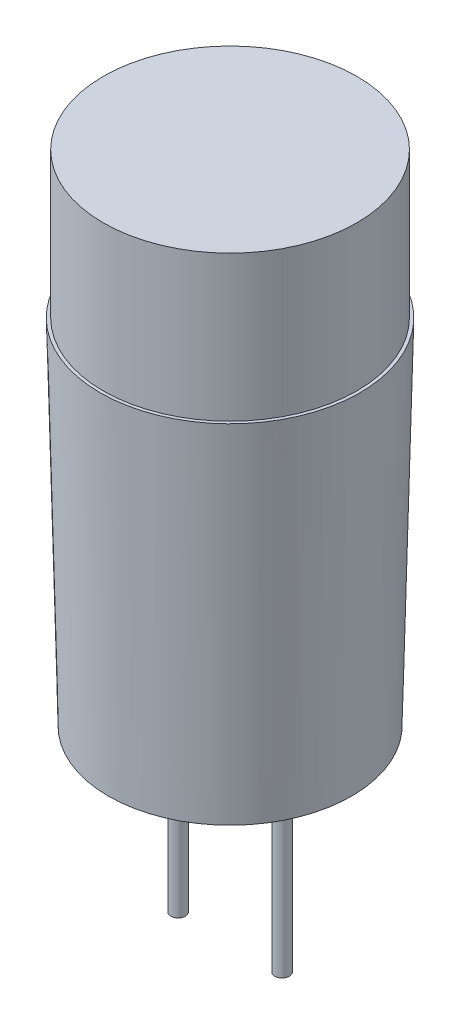
ISO-10303-21;
HEADER;
FILE_DESCRIPTION(('STEP AP214'),'2;1');
FILE_NAME('part.step','',(''),(''),'','','');
FILE_SCHEMA(('AUTOMOTIVE_DESIGN { 1 0 10303 214 1 1 1 1 }'));
ENDSEC;
DATA;
#1=APPLICATION_CONTEXT('core data for automotive mechanical design processes');
#2=APPLICATION_PROTOCOL_DEFINITION('international standard','automotive_design',2000,#1);
#3=PRODUCT_CONTEXT('',#1,'mechanical');
#4=PRODUCT('Part','Part','',(#3));
#5=PRODUCT_RELATED_PRODUCT_CATEGORY('part','',(#4));
#6=PRODUCT_DEFINITION_FORMATION('','',#4);
#7=PRODUCT_DEFINITION_CONTEXT('part definition',#1,'design');
#8=PRODUCT_DEFINITION('design','',#6,#7);
#9=PRODUCT_DEFINITION_SHAPE('','',#8);
#10=(LENGTH_UNIT() NAMED_UNIT(*) SI_UNIT(.MILLI.,.METRE.));
#11=(NAMED_UNIT(*) PLANE_ANGLE_UNIT() SI_UNIT($,.RADIAN.));
#12=(NAMED_UNIT(*) SI_UNIT($,.STERADIAN.) SOLID_ANGLE_UNIT());
#13=UNCERTAINTY_MEASURE_WITH_UNIT(LENGTH_MEASURE(1.E-05),#10,'distance_accuracy_value','');
#14=(GEOMETRIC_REPRESENTATION_CONTEXT(3) GLOBAL_UNCERTAINTY_ASSIGNED_CONTEXT((#13)) GLOBAL_UNIT_ASSIGNED_CONTEXT((#10,
#11,#12)) REPRESENTATION_CONTEXT('',''));
#15=CARTESIAN_POINT('',(0.,0.,0.));
#16=DIRECTION('',(0.,0.,1.));
#17=DIRECTION('',(1.,0.,0.));
#18=AXIS2_PLACEMENT_3D('',#15,#16,#17);
#19=CARTESIAN_POINT('',(0.,0.,0.));
#20=DIRECTION('',(0.,-1.,0.));
#21=DIRECTION('',(0.,0.,-1.));
#22=AXIS2_PLACEMENT_3D('',#19,#20,#21);
#23=PLANE('',#22);
#24=CARTESIAN_POINT('',(0.,0.,0.));
#25=DIRECTION('',(0.,-1.,0.));
#26=DIRECTION('',(0.,0.,-1.));
#27=AXIS2_PLACEMENT_3D('',#24,#25,#26);
#28=CIRCLE('',#27,6.1);
#29=CARTESIAN_POINT('',(0.,0.,-6.1));
#30=VERTEX_POINT('',#29);
#31=EDGE_CURVE('E40',#30,#30,#28,.F.);
#32=ORIENTED_EDGE('',*,*,#31,.F.);
#33=EDGE_LOOP('',(#32));
#34=FACE_BOUND('',#33,.T.);
#35=CARTESIAN_POINT('',(0.,0.,0.));
#36=DIRECTION('',(0.,1.,0.));
#37=DIRECTION('',(0.,0.,1.));
#38=AXIS2_PLACEMENT_3D('',#35,#36,#37);
#39=CIRCLE('',#38,6.25);
#40=CARTESIAN_POINT('',(0.,0.,6.25));
#41=VERTEX_POINT('',#40);
#42=EDGE_CURVE('E44',#41,#41,#39,.T.);
#43=ORIENTED_EDGE('',*,*,#42,.T.);
#44=EDGE_LOOP('',(#43));
#45=FACE_BOUND('',#44,.T.);
#46=ADVANCED_FACE('F30',(#34,#45),#23,.F.);
#47=CARTESIAN_POINT('',(0.,-17.,0.));
#48=DIRECTION('',(0.,1.,0.));
#49=DIRECTION('',(0.,0.,1.));
#50=AXIS2_PLACEMENT_3D('',#47,#48,#49);
#51=CONICAL_SURFACE('',#50,5.85,0.0235250709852169);
#52=ORIENTED_EDGE('',*,*,#42,.F.);
#53=EDGE_LOOP('',(#52));
#54=FACE_BOUND('',#53,.T.);
#55=CARTESIAN_POINT('',(0.,-17.,0.));
#56=DIRECTION('',(0.,1.,0.));
#57=DIRECTION('',(0.,0.,1.));
#58=AXIS2_PLACEMENT_3D('',#55,#56,#57);
#59=CIRCLE('',#58,5.85);
#60=CARTESIAN_POINT('',(0.,-17.,5.85));
#61=VERTEX_POINT('',#60);
#62=EDGE_CURVE('E49',#61,#61,#59,.T.);
#63=ORIENTED_EDGE('',*,*,#62,.T.);
#64=EDGE_LOOP('',(#63));
#65=FACE_BOUND('',#64,.T.);
#66=ADVANCED_FACE('F77',(#54,#65),#51,.T.);
#67=CARTESIAN_POINT('',(5.85,-17.,0.));
#68=DIRECTION('',(0.,1.,0.));
#69=DIRECTION('',(0.,0.,1.));
#70=AXIS2_PLACEMENT_3D('',#67,#68,#69);
#71=PLANE('',#70);
#72=CARTESIAN_POINT('',(2.5,-17.,0.));
#73=DIRECTION('',(0.,1.,0.));
#74=DIRECTION('',(0.,0.,1.));
#75=AXIS2_PLACEMENT_3D('',#72,#73,#74);
#76=CIRCLE('',#75,0.35);
#77=CARTESIAN_POINT('',(2.5,-17.,0.350000000000001));
#78=VERTEX_POINT('',#77);
#79=EDGE_CURVE('E10',#78,#78,#76,.F.);
#80=ORIENTED_EDGE('',*,*,#79,.F.);
#81=EDGE_LOOP('',(#80));
#82=FACE_BOUND('',#81,.T.);
#83=CARTESIAN_POINT('',(-2.5,-17.,0.));
#84=DIRECTION('',(0.,1.,0.));
#85=DIRECTION('',(0.,0.,1.));
#86=AXIS2_PLACEMENT_3D('',#83,#84,#85);
#87=CIRCLE('',#86,0.35);
#88=CARTESIAN_POINT('',(-2.5,-17.,0.35));
#89=VERTEX_POINT('',#88);
#90=EDGE_CURVE('E36',#89,#89,#87,.F.);
#91=ORIENTED_EDGE('',*,*,#90,.F.);
#92=EDGE_LOOP('',(#91));
#93=FACE_BOUND('',#92,.T.);
#94=ORIENTED_EDGE('',*,*,#62,.F.);
#95=EDGE_LOOP('',(#94));
#96=FACE_BOUND('',#95,.T.);
#97=ADVANCED_FACE('F82',(#82,#93,#96),#71,.F.);
#98=CARTESIAN_POINT('',(0.,7.,0.));
#99=DIRECTION('',(0.,-1.,0.));
#100=DIRECTION('',(0.,0.,-1.));
#101=AXIS2_PLACEMENT_3D('',#98,#99,#100);
#102=CYLINDRICAL_SURFACE('',#101,6.1);
#103=CARTESIAN_POINT('',(0.,7.,0.));
#104=DIRECTION('',(0.,1.,0.));
#105=DIRECTION('',(0.,0.,1.));
#106=AXIS2_PLACEMENT_3D('',#103,#104,#105);
#107=CIRCLE('',#106,6.1);
#108=CARTESIAN_POINT('',(0.,7.,6.1));
#109=VERTEX_POINT('',#108);
#110=EDGE_CURVE('E52',#109,#109,#107,.T.);
#111=ORIENTED_EDGE('',*,*,#110,.F.);
#112=EDGE_LOOP('',(#111));
#113=FACE_BOUND('',#112,.T.);
#114=ORIENTED_EDGE('',*,*,#31,.T.);
#115=EDGE_LOOP('',(#114));
#116=FACE_BOUND('',#115,.T.);
#117=ADVANCED_FACE('F91',(#113,#116),#102,.T.);
#118=CARTESIAN_POINT('',(0.,7.,0.));
#119=DIRECTION('',(0.,1.,0.));
#120=DIRECTION('',(0.,0.,1.));
#121=AXIS2_PLACEMENT_3D('',#118,#119,#120);
#122=PLANE('',#121);
#123=ORIENTED_EDGE('',*,*,#110,.T.);
#124=EDGE_LOOP('',(#123));
#125=FACE_BOUND('',#124,.T.);
#126=ADVANCED_FACE('F97',(#125),#122,.T.);
#127=CARTESIAN_POINT('',(-2.5,-26.,0.));
#128=DIRECTION('',(0.,1.,0.));
#129=DIRECTION('',(0.,0.,1.));
#130=AXIS2_PLACEMENT_3D('',#127,#128,#129);
#131=CYLINDRICAL_SURFACE('',#130,0.35);
#132=CARTESIAN_POINT('',(-2.5,-26.,0.));
#133=DIRECTION('',(0.,-1.,0.));
#134=DIRECTION('',(0.,0.,-1.));
#135=AXIS2_PLACEMENT_3D('',#132,#133,#134);
#136=CIRCLE('',#135,0.35);
#137=CARTESIAN_POINT('',(-2.5,-26.,-0.35));
#138=VERTEX_POINT('',#137);
#139=EDGE_CURVE('E55',#138,#138,#136,.T.);
#140=ORIENTED_EDGE('',*,*,#139,.F.);
#141=EDGE_LOOP('',(#140));
#142=FACE_BOUND('',#141,.T.);
#143=ORIENTED_EDGE('',*,*,#90,.T.);
#144=EDGE_LOOP('',(#143));
#145=FACE_BOUND('',#144,.T.);
#146=ADVANCED_FACE('F73',(#142,#145),#131,.T.);
#147=CARTESIAN_POINT('',(-2.5,-26.,0.));
#148=DIRECTION('',(0.,-1.,0.));
#149=DIRECTION('',(0.,0.,-1.));
#150=AXIS2_PLACEMENT_3D('',#147,#148,#149);
#151=PLANE('',#150);
#152=ORIENTED_EDGE('',*,*,#139,.T.);
#153=EDGE_LOOP('',(#152));
#154=FACE_BOUND('',#153,.T.);
#155=ADVANCED_FACE('F66',(#154),#151,.T.);
#156=CARTESIAN_POINT('',(2.5,-26.,0.));
#157=DIRECTION('',(0.,1.,0.));
#158=DIRECTION('',(0.,0.,1.));
#159=AXIS2_PLACEMENT_3D('',#156,#157,#158);
#160=CYLINDRICAL_SURFACE('',#159,0.35);
#161=CARTESIAN_POINT('',(2.5,-26.,0.));
#162=DIRECTION('',(0.,-1.,0.));
#163=DIRECTION('',(0.,0.,1.));
#164=AXIS2_PLACEMENT_3D('',#161,#162,#163);
#165=CIRCLE('',#164,0.35);
#166=CARTESIAN_POINT('',(2.5,-26.,0.350000000000001));
#167=VERTEX_POINT('',#166);
#168=EDGE_CURVE('E58',#167,#167,#165,.T.);
#169=ORIENTED_EDGE('',*,*,#168,.F.);
#170=EDGE_LOOP('',(#169));
#171=FACE_BOUND('',#170,.T.);
#172=ORIENTED_EDGE('',*,*,#79,.T.);
#173=EDGE_LOOP('',(#172));
#174=FACE_BOUND('',#173,.T.);
#175=ADVANCED_FACE('F64',(#171,#174),#160,.T.);
#176=CARTESIAN_POINT('',(2.5,-26.,0.));
#177=DIRECTION('',(0.,1.,0.));
#178=DIRECTION('',(0.,0.,1.));
#179=AXIS2_PLACEMENT_3D('',#176,#177,#178);
#180=PLANE('',#179);
#181=ORIENTED_EDGE('',*,*,#168,.T.);
#182=EDGE_LOOP('',(#181));
#183=FACE_BOUND('',#182,.T.);
#184=ADVANCED_FACE('F62',(#183),#180,.F.);
#185=CLOSED_SHELL('',(#46,#66,#97,#117,#126,#146,#155,#175,#184));
#186=MANIFOLD_SOLID_BREP('B2',#185);
#187=ADVANCED_BREP_SHAPE_REPRESENTATION('',(#18,#186),#14);
#188=SHAPE_DEFINITION_REPRESENTATION(#9,#187);
ENDSEC;
END-ISO-10303-21;
